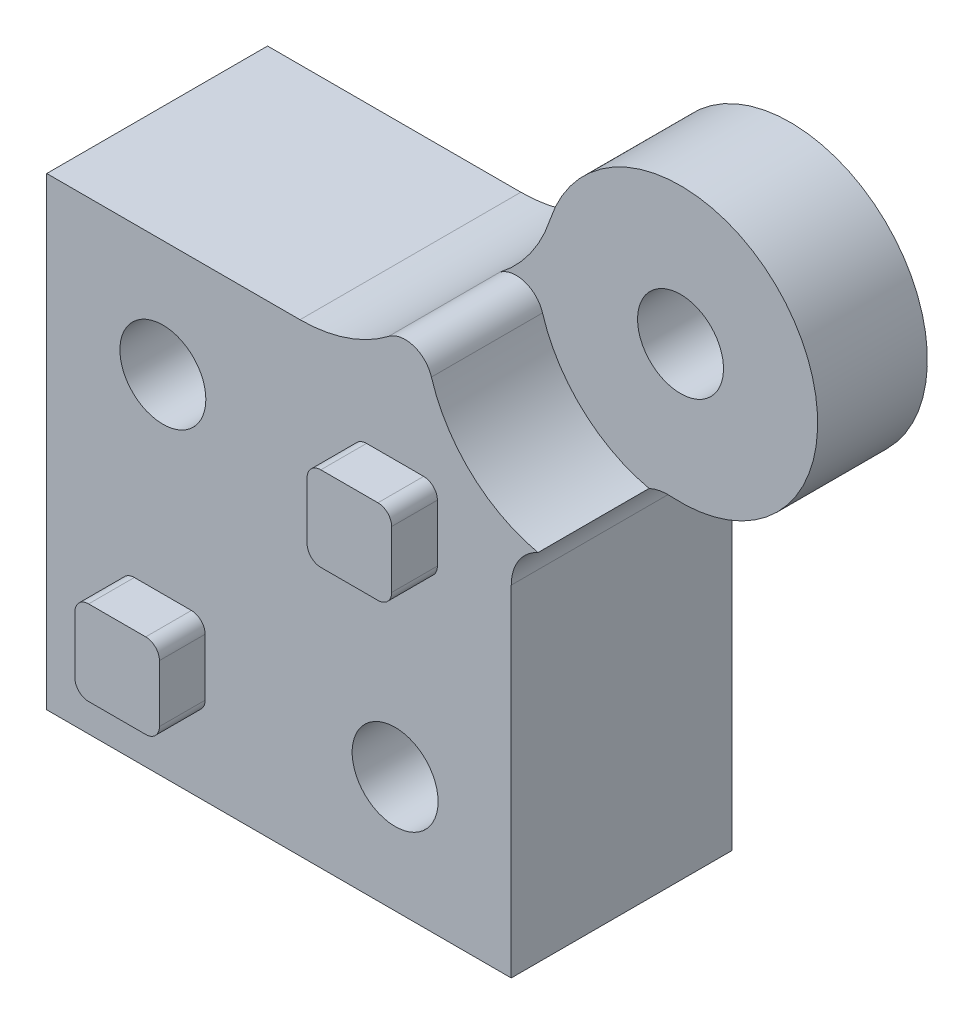
ISO-10303-21;
HEADER;
FILE_DESCRIPTION(('STEP AP214'),'2;1');
FILE_NAME('part.step','',(''),(''),'','','');
FILE_SCHEMA(('AUTOMOTIVE_DESIGN { 1 0 10303 214 1 1 1 1 }'));
ENDSEC;
DATA;
#1=APPLICATION_CONTEXT('core data for automotive mechanical design processes');
#2=APPLICATION_PROTOCOL_DEFINITION('international standard','automotive_design',2000,#1);
#3=PRODUCT_CONTEXT('',#1,'mechanical');
#4=PRODUCT('Part','Part','',(#3));
#5=PRODUCT_RELATED_PRODUCT_CATEGORY('part','',(#4));
#6=PRODUCT_DEFINITION_FORMATION('','',#4);
#7=PRODUCT_DEFINITION_CONTEXT('part definition',#1,'design');
#8=PRODUCT_DEFINITION('design','',#6,#7);
#9=PRODUCT_DEFINITION_SHAPE('','',#8);
#10=(LENGTH_UNIT() NAMED_UNIT(*) SI_UNIT(.MILLI.,.METRE.));
#11=(NAMED_UNIT(*) PLANE_ANGLE_UNIT() SI_UNIT($,.RADIAN.));
#12=(NAMED_UNIT(*) SI_UNIT($,.STERADIAN.) SOLID_ANGLE_UNIT());
#13=UNCERTAINTY_MEASURE_WITH_UNIT(LENGTH_MEASURE(1.E-05),#10,'distance_accuracy_value','');
#14=(GEOMETRIC_REPRESENTATION_CONTEXT(3) GLOBAL_UNCERTAINTY_ASSIGNED_CONTEXT((#13)) GLOBAL_UNIT_ASSIGNED_CONTEXT((#10,
#11,#12)) REPRESENTATION_CONTEXT('',''));
#15=CARTESIAN_POINT('',(0.,0.,0.));
#16=DIRECTION('',(0.,0.,1.));
#17=DIRECTION('',(1.,0.,0.));
#18=AXIS2_PLACEMENT_3D('',#15,#16,#17);
#19=CARTESIAN_POINT('',(66.6819805153394,193.68198051534,0.));
#20=DIRECTION('',(0.,0.,1.));
#21=DIRECTION('',(1.,0.,0.));
#22=AXIS2_PLACEMENT_3D('',#19,#20,#21);
#23=PLANE('',#22);
#24=CARTESIAN_POINT('',(44.45,184.15,0.));
#25=DIRECTION('',(0.,0.,1.));
#26=DIRECTION('',(1.,0.,0.));
#27=AXIS2_PLACEMENT_3D('',#24,#25,#26);
#28=CIRCLE('',#27,2.34999999999999);
#29=CARTESIAN_POINT('',(46.8,184.15,0.));
#30=VERTEX_POINT('',#29);
#31=EDGE_CURVE('E252',#30,#30,#28,.T.);
#32=ORIENTED_EDGE('',*,*,#31,.F.);
#33=EDGE_LOOP('',(#32));
#34=FACE_BOUND('',#33,.T.);
#35=CARTESIAN_POINT('',(57.15,171.45,0.));
#36=DIRECTION('',(0.,0.,1.));
#37=DIRECTION('',(1.,0.,0.));
#38=AXIS2_PLACEMENT_3D('',#35,#36,#37);
#39=CIRCLE('',#38,2.34999999999997);
#40=CARTESIAN_POINT('',(59.5,171.45,0.));
#41=VERTEX_POINT('',#40);
#42=EDGE_CURVE('E243',#41,#41,#39,.T.);
#43=ORIENTED_EDGE('',*,*,#42,.F.);
#44=EDGE_LOOP('',(#43));
#45=FACE_BOUND('',#44,.T.);
#46=CARTESIAN_POINT('',(66.6819805153394,193.68198051534,0.));
#47=DIRECTION('',(0.,0.,-1.));
#48=DIRECTION('',(1.,0.,0.));
#49=AXIS2_PLACEMENT_3D('',#46,#47,#48);
#50=CIRCLE('',#49,7.89061359961946);
#51=CARTESIAN_POINT('',(64.9642375577398,185.980607773411,0.));
#52=VERTEX_POINT('',#51);
#53=CARTESIAN_POINT('',(59.1355752557885,191.376866497092,0.));
#54=VERTEX_POINT('',#53);
#55=EDGE_CURVE('E269',#52,#54,#50,.T.);
#56=ORIENTED_EDGE('',*,*,#55,.T.);
#57=CARTESIAN_POINT('',(57.701009014974,190.938665971402,0.));
#58=DIRECTION('',(0.,0.,1.));
#59=DIRECTION('',(1.,0.,0.));
#60=AXIS2_PLACEMENT_3D('',#57,#58,#59);
#61=CIRCLE('',#60,1.5);
#62=CARTESIAN_POINT('',(56.7929258165762,192.132560818022,0.));
#63=VERTEX_POINT('',#62);
#64=EDGE_CURVE('E348',#54,#63,#61,.T.);
#65=ORIENTED_EDGE('',*,*,#64,.T.);
#66=CARTESIAN_POINT('',(51.9498154251216,198.5,0.));
#67=DIRECTION('',(0.,0.,1.));
#68=DIRECTION('',(1.,0.,0.));
#69=AXIS2_PLACEMENT_3D('',#66,#67,#68);
#70=CIRCLE('',#69,8.);
#71=CARTESIAN_POINT('',(51.9498154251216,190.5,0.));
#72=VERTEX_POINT('',#71);
#73=EDGE_CURVE('E341',#63,#72,#70,.F.);
#74=ORIENTED_EDGE('',*,*,#73,.T.);
#75=DIRECTION('',(-1.,0.,0.));
#76=VECTOR('',#75,1.);
#77=CARTESIAN_POINT('',(38.1,190.5,0.));
#78=LINE('',#77,#76);
#79=CARTESIAN_POINT('',(38.1,190.5,0.));
#80=VERTEX_POINT('',#79);
#81=EDGE_CURVE('E285',#72,#80,#78,.T.);
#82=ORIENTED_EDGE('',*,*,#81,.T.);
#83=DIRECTION('',(0.,-1.,0.));
#84=VECTOR('',#83,1.);
#85=CARTESIAN_POINT('',(38.1,165.1,0.));
#86=LINE('',#85,#84);
#87=CARTESIAN_POINT('',(38.1,165.1,0.));
#88=VERTEX_POINT('',#87);
#89=EDGE_CURVE('E287',#80,#88,#86,.T.);
#90=ORIENTED_EDGE('',*,*,#89,.T.);
#91=DIRECTION('',(1.,0.,0.));
#92=VECTOR('',#91,1.);
#93=CARTESIAN_POINT('',(63.5,165.1,0.));
#94=LINE('',#93,#92);
#95=CARTESIAN_POINT('',(63.5,165.1,0.));
#96=VERTEX_POINT('',#95);
#97=EDGE_CURVE('E290',#88,#96,#94,.T.);
#98=ORIENTED_EDGE('',*,*,#97,.T.);
#99=DIRECTION('',(0.,1.,0.));
#100=VECTOR('',#99,1.);
#101=CARTESIAN_POINT('',(63.5,186.4614,0.));
#102=LINE('',#101,#100);
#103=CARTESIAN_POINT('',(63.5,183.70526248902,0.));
#104=VERTEX_POINT('',#103);
#105=EDGE_CURVE('E215',#96,#104,#102,.T.);
#106=ORIENTED_EDGE('',*,*,#105,.T.);
#107=CARTESIAN_POINT('',(66.,183.70526248902,0.));
#108=DIRECTION('',(0.,0.,1.));
#109=DIRECTION('',(1.,0.,0.));
#110=AXIS2_PLACEMENT_3D('',#107,#108,#109);
#111=CIRCLE('',#110,2.5);
#112=EDGE_CURVE('E324',#104,#52,#111,.F.);
#113=ORIENTED_EDGE('',*,*,#112,.T.);
#114=EDGE_LOOP('',(#56,#65,#74,#82,#90,#98,#106,#113));
#115=FACE_BOUND('',#114,.T.);
#116=DIRECTION('',(0.,1.,0.));
#117=VECTOR('',#116,1.);
#118=CARTESIAN_POINT('',(59.4614,181.8386,0.));
#119=LINE('',#118,#117);
#120=CARTESIAN_POINT('',(59.4614,182.5886,0.));
#121=VERTEX_POINT('',#120);
#122=CARTESIAN_POINT('',(59.4614,185.7114,0.));
#123=VERTEX_POINT('',#122);
#124=EDGE_CURVE('E219',#121,#123,#119,.T.);
#125=ORIENTED_EDGE('',*,*,#124,.F.);
#126=CARTESIAN_POINT('',(58.7114,182.5886,0.));
#127=DIRECTION('',(0.,0.,1.));
#128=DIRECTION('',(1.,0.,0.));
#129=AXIS2_PLACEMENT_3D('',#126,#127,#128);
#130=CIRCLE('',#129,0.75);
#131=CARTESIAN_POINT('',(58.7114,181.8386,0.));
#132=VERTEX_POINT('',#131);
#133=EDGE_CURVE('E412',#121,#132,#130,.F.);
#134=ORIENTED_EDGE('',*,*,#133,.T.);
#135=DIRECTION('',(1.,0.,0.));
#136=VECTOR('',#135,1.);
#137=CARTESIAN_POINT('',(54.8386,181.8386,0.));
#138=LINE('',#137,#136);
#139=CARTESIAN_POINT('',(55.5886,181.8386,0.));
#140=VERTEX_POINT('',#139);
#141=EDGE_CURVE('E300',#140,#132,#138,.T.);
#142=ORIENTED_EDGE('',*,*,#141,.F.);
#143=CARTESIAN_POINT('',(55.5886,182.5886,0.));
#144=DIRECTION('',(0.,0.,1.));
#145=DIRECTION('',(1.,0.,0.));
#146=AXIS2_PLACEMENT_3D('',#143,#144,#145);
#147=CIRCLE('',#146,0.75);
#148=CARTESIAN_POINT('',(54.8386,182.5886,0.));
#149=VERTEX_POINT('',#148);
#150=EDGE_CURVE('E416',#140,#149,#147,.F.);
#151=ORIENTED_EDGE('',*,*,#150,.T.);
#152=DIRECTION('',(0.,-1.,0.));
#153=VECTOR('',#152,1.);
#154=CARTESIAN_POINT('',(54.8386,186.4614,0.));
#155=LINE('',#154,#153);
#156=CARTESIAN_POINT('',(54.8386,185.7114,0.));
#157=VERTEX_POINT('',#156);
#158=EDGE_CURVE('E315',#157,#149,#155,.T.);
#159=ORIENTED_EDGE('',*,*,#158,.F.);
#160=CARTESIAN_POINT('',(55.5886,185.7114,0.));
#161=DIRECTION('',(0.,0.,1.));
#162=DIRECTION('',(1.,0.,0.));
#163=AXIS2_PLACEMENT_3D('',#160,#161,#162);
#164=CIRCLE('',#163,0.75);
#165=CARTESIAN_POINT('',(55.5886,186.4614,0.));
#166=VERTEX_POINT('',#165);
#167=EDGE_CURVE('E414',#157,#166,#164,.F.);
#168=ORIENTED_EDGE('',*,*,#167,.T.);
#169=DIRECTION('',(-1.,0.,0.));
#170=VECTOR('',#169,1.);
#171=CARTESIAN_POINT('',(59.4614,186.4614,0.));
#172=LINE('',#171,#170);
#173=CARTESIAN_POINT('',(58.7114,186.4614,0.));
#174=VERTEX_POINT('',#173);
#175=EDGE_CURVE('E312',#174,#166,#172,.T.);
#176=ORIENTED_EDGE('',*,*,#175,.F.);
#177=CARTESIAN_POINT('',(58.7114,185.7114,0.));
#178=DIRECTION('',(0.,0.,1.));
#179=DIRECTION('',(1.,0.,0.));
#180=AXIS2_PLACEMENT_3D('',#177,#178,#179);
#181=CIRCLE('',#180,0.75);
#182=EDGE_CURVE('E410',#174,#123,#181,.F.);
#183=ORIENTED_EDGE('',*,*,#182,.T.);
#184=EDGE_LOOP('',(#125,#134,#142,#151,#159,#168,#176,#183));
#185=FACE_BOUND('',#184,.T.);
#186=DIRECTION('',(0.,-1.,0.));
#187=VECTOR('',#186,1.);
#188=CARTESIAN_POINT('',(42.1386,173.7614,0.));
#189=LINE('',#188,#187);
#190=CARTESIAN_POINT('',(42.1386,173.0114,0.));
#191=VERTEX_POINT('',#190);
#192=CARTESIAN_POINT('',(42.1386,169.8886,0.));
#193=VERTEX_POINT('',#192);
#194=EDGE_CURVE('E272',#191,#193,#189,.T.);
#195=ORIENTED_EDGE('',*,*,#194,.F.);
#196=CARTESIAN_POINT('',(42.8886,173.0114,0.));
#197=DIRECTION('',(0.,0.,1.));
#198=DIRECTION('',(1.,0.,0.));
#199=AXIS2_PLACEMENT_3D('',#196,#197,#198);
#200=CIRCLE('',#199,0.75);
#201=CARTESIAN_POINT('',(42.8886,173.7614,0.));
#202=VERTEX_POINT('',#201);
#203=EDGE_CURVE('E11',#191,#202,#200,.F.);
#204=ORIENTED_EDGE('',*,*,#203,.T.);
#205=DIRECTION('',(-1.,0.,0.));
#206=VECTOR('',#205,1.);
#207=CARTESIAN_POINT('',(46.7614,173.7614,0.));
#208=LINE('',#207,#206);
#209=CARTESIAN_POINT('',(46.0114,173.7614,0.));
#210=VERTEX_POINT('',#209);
#211=EDGE_CURVE('E255',#210,#202,#208,.T.);
#212=ORIENTED_EDGE('',*,*,#211,.F.);
#213=CARTESIAN_POINT('',(46.0114,173.0114,0.));
#214=DIRECTION('',(0.,0.,1.));
#215=DIRECTION('',(1.,0.,0.));
#216=AXIS2_PLACEMENT_3D('',#213,#214,#215);
#217=CIRCLE('',#216,0.75);
#218=CARTESIAN_POINT('',(46.7614,173.0114,0.));
#219=VERTEX_POINT('',#218);
#220=EDGE_CURVE('E418',#210,#219,#217,.F.);
#221=ORIENTED_EDGE('',*,*,#220,.T.);
#222=DIRECTION('',(0.,1.,0.));
#223=VECTOR('',#222,1.);
#224=CARTESIAN_POINT('',(46.7614,169.1386,0.));
#225=LINE('',#224,#223);
#226=CARTESIAN_POINT('',(46.7614,169.8886,0.));
#227=VERTEX_POINT('',#226);
#228=EDGE_CURVE('E260',#227,#219,#225,.T.);
#229=ORIENTED_EDGE('',*,*,#228,.F.);
#230=CARTESIAN_POINT('',(46.0114,169.8886,0.));
#231=DIRECTION('',(0.,0.,1.));
#232=DIRECTION('',(1.,0.,0.));
#233=AXIS2_PLACEMENT_3D('',#230,#231,#232);
#234=CIRCLE('',#233,0.75);
#235=CARTESIAN_POINT('',(46.0114,169.1386,0.));
#236=VERTEX_POINT('',#235);
#237=EDGE_CURVE('E420',#227,#236,#234,.F.);
#238=ORIENTED_EDGE('',*,*,#237,.T.);
#239=DIRECTION('',(1.,0.,0.));
#240=VECTOR('',#239,1.);
#241=CARTESIAN_POINT('',(42.1386,169.1386,0.));
#242=LINE('',#241,#240);
#243=CARTESIAN_POINT('',(42.8886,169.1386,0.));
#244=VERTEX_POINT('',#243);
#245=EDGE_CURVE('E274',#244,#236,#242,.T.);
#246=ORIENTED_EDGE('',*,*,#245,.F.);
#247=CARTESIAN_POINT('',(42.8886,169.8886,0.));
#248=DIRECTION('',(0.,0.,1.));
#249=DIRECTION('',(1.,0.,0.));
#250=AXIS2_PLACEMENT_3D('',#247,#248,#249);
#251=CIRCLE('',#250,0.75);
#252=EDGE_CURVE('E43',#244,#193,#251,.F.);
#253=ORIENTED_EDGE('',*,*,#252,.T.);
#254=EDGE_LOOP('',(#195,#204,#212,#221,#229,#238,#246,#253));
#255=FACE_BOUND('',#254,.T.);
#256=ADVANCED_FACE('F35',(#34,#45,#115,#185,#255),#23,.T.);
#257=CARTESIAN_POINT('',(59.4614,181.8386,2.5));
#258=DIRECTION('',(-1.,0.,0.));
#259=DIRECTION('',(0.,0.,1.));
#260=AXIS2_PLACEMENT_3D('',#257,#258,#259);
#261=PLANE('',#260);
#262=ORIENTED_EDGE('',*,*,#124,.T.);
#263=DIRECTION('',(0.,0.,-1.));
#264=VECTOR('',#263,1.);
#265=CARTESIAN_POINT('',(59.4614,185.7114,2.5));
#266=LINE('',#265,#264);
#267=CARTESIAN_POINT('',(59.4614,185.7114,2.5));
#268=VERTEX_POINT('',#267);
#269=EDGE_CURVE('E363',#123,#268,#266,.F.);
#270=ORIENTED_EDGE('',*,*,#269,.T.);
#271=DIRECTION('',(0.,1.,0.));
#272=VECTOR('',#271,1.);
#273=CARTESIAN_POINT('',(59.4614,181.8386,2.5));
#274=LINE('',#273,#272);
#275=CARTESIAN_POINT('',(59.4614,182.5886,2.5));
#276=VERTEX_POINT('',#275);
#277=EDGE_CURVE('E296',#276,#268,#274,.T.);
#278=ORIENTED_EDGE('',*,*,#277,.F.);
#279=DIRECTION('',(0.,0.,-1.));
#280=VECTOR('',#279,1.);
#281=CARTESIAN_POINT('',(59.4614,182.5886,2.5));
#282=LINE('',#281,#280);
#283=EDGE_CURVE('E360',#276,#121,#282,.T.);
#284=ORIENTED_EDGE('',*,*,#283,.T.);
#285=EDGE_LOOP('',(#262,#270,#278,#284));
#286=FACE_BOUND('',#285,.T.);
#287=ADVANCED_FACE('F460',(#286),#261,.F.);
#288=CARTESIAN_POINT('',(59.4614,186.4614,2.5));
#289=DIRECTION('',(0.,-1.,0.));
#290=DIRECTION('',(0.,0.,-1.));
#291=AXIS2_PLACEMENT_3D('',#288,#289,#290);
#292=PLANE('',#291);
#293=DIRECTION('',(-1.,0.,0.));
#294=VECTOR('',#293,1.);
#295=CARTESIAN_POINT('',(59.4614,186.4614,2.5));
#296=LINE('',#295,#294);
#297=CARTESIAN_POINT('',(58.7114,186.4614,2.5));
#298=VERTEX_POINT('',#297);
#299=CARTESIAN_POINT('',(55.5886,186.4614,2.5));
#300=VERTEX_POINT('',#299);
#301=EDGE_CURVE('E299',#298,#300,#296,.T.);
#302=ORIENTED_EDGE('',*,*,#301,.F.);
#303=DIRECTION('',(0.,0.,-1.));
#304=VECTOR('',#303,1.);
#305=CARTESIAN_POINT('',(58.7114,186.4614,2.5));
#306=LINE('',#305,#304);
#307=EDGE_CURVE('E357',#298,#174,#306,.T.);
#308=ORIENTED_EDGE('',*,*,#307,.T.);
#309=ORIENTED_EDGE('',*,*,#175,.T.);
#310=DIRECTION('',(0.,0.,-1.));
#311=VECTOR('',#310,1.);
#312=CARTESIAN_POINT('',(55.5886,186.4614,2.5));
#313=LINE('',#312,#311);
#314=EDGE_CURVE('E355',#166,#300,#313,.F.);
#315=ORIENTED_EDGE('',*,*,#314,.T.);
#316=EDGE_LOOP('',(#302,#308,#309,#315));
#317=FACE_BOUND('',#316,.T.);
#318=ADVANCED_FACE('F467',(#317),#292,.F.);
#319=CARTESIAN_POINT('',(54.8386,186.4614,2.5));
#320=DIRECTION('',(1.,0.,0.));
#321=DIRECTION('',(0.,0.,-1.));
#322=AXIS2_PLACEMENT_3D('',#319,#320,#321);
#323=PLANE('',#322);
#324=DIRECTION('',(0.,-1.,0.));
#325=VECTOR('',#324,1.);
#326=CARTESIAN_POINT('',(54.8386,186.4614,2.5));
#327=LINE('',#326,#325);
#328=CARTESIAN_POINT('',(54.8386,185.7114,2.5));
#329=VERTEX_POINT('',#328);
#330=CARTESIAN_POINT('',(54.8386,182.5886,2.5));
#331=VERTEX_POINT('',#330);
#332=EDGE_CURVE('E303',#329,#331,#327,.T.);
#333=ORIENTED_EDGE('',*,*,#332,.F.);
#334=DIRECTION('',(0.,0.,-1.));
#335=VECTOR('',#334,1.);
#336=CARTESIAN_POINT('',(54.8386,185.7114,2.5));
#337=LINE('',#336,#335);
#338=EDGE_CURVE('E380',#329,#157,#337,.T.);
#339=ORIENTED_EDGE('',*,*,#338,.T.);
#340=ORIENTED_EDGE('',*,*,#158,.T.);
#341=DIRECTION('',(0.,0.,-1.));
#342=VECTOR('',#341,1.);
#343=CARTESIAN_POINT('',(54.8386,182.5886,2.5));
#344=LINE('',#343,#342);
#345=EDGE_CURVE('E378',#149,#331,#344,.F.);
#346=ORIENTED_EDGE('',*,*,#345,.T.);
#347=EDGE_LOOP('',(#333,#339,#340,#346));
#348=FACE_BOUND('',#347,.T.);
#349=ADVANCED_FACE('F498',(#348),#323,.F.);
#350=CARTESIAN_POINT('',(54.8386,181.8386,2.5));
#351=DIRECTION('',(0.,1.,0.));
#352=DIRECTION('',(0.,0.,1.));
#353=AXIS2_PLACEMENT_3D('',#350,#351,#352);
#354=PLANE('',#353);
#355=ORIENTED_EDGE('',*,*,#141,.T.);
#356=DIRECTION('',(0.,0.,-1.));
#357=VECTOR('',#356,1.);
#358=CARTESIAN_POINT('',(58.7114,181.8386,2.5));
#359=LINE('',#358,#357);
#360=CARTESIAN_POINT('',(58.7114,181.8386,2.5));
#361=VERTEX_POINT('',#360);
#362=EDGE_CURVE('E376',#132,#361,#359,.F.);
#363=ORIENTED_EDGE('',*,*,#362,.T.);
#364=DIRECTION('',(1.,0.,0.));
#365=VECTOR('',#364,1.);
#366=CARTESIAN_POINT('',(54.8386,181.8386,2.5));
#367=LINE('',#366,#365);
#368=CARTESIAN_POINT('',(55.5886,181.8386,2.5));
#369=VERTEX_POINT('',#368);
#370=EDGE_CURVE('E306',#369,#361,#367,.T.);
#371=ORIENTED_EDGE('',*,*,#370,.F.);
#372=DIRECTION('',(0.,0.,-1.));
#373=VECTOR('',#372,1.);
#374=CARTESIAN_POINT('',(55.5886,181.8386,2.5));
#375=LINE('',#374,#373);
#376=EDGE_CURVE('E373',#369,#140,#375,.T.);
#377=ORIENTED_EDGE('',*,*,#376,.T.);
#378=EDGE_LOOP('',(#355,#363,#371,#377));
#379=FACE_BOUND('',#378,.T.);
#380=ADVANCED_FACE('F494',(#379),#354,.F.);
#381=CARTESIAN_POINT('',(0.,0.,2.5));
#382=DIRECTION('',(0.,0.,1.));
#383=DIRECTION('',(1.,0.,0.));
#384=AXIS2_PLACEMENT_3D('',#381,#382,#383);
#385=PLANE('',#384);
#386=ORIENTED_EDGE('',*,*,#277,.T.);
#387=CARTESIAN_POINT('',(58.7114,185.7114,2.5));
#388=DIRECTION('',(0.,0.,1.));
#389=DIRECTION('',(1.,0.,0.));
#390=AXIS2_PLACEMENT_3D('',#387,#388,#389);
#391=CIRCLE('',#390,0.75);
#392=EDGE_CURVE('E371',#268,#298,#391,.T.);
#393=ORIENTED_EDGE('',*,*,#392,.T.);
#394=ORIENTED_EDGE('',*,*,#301,.T.);
#395=CARTESIAN_POINT('',(55.5886,185.7114,2.5));
#396=DIRECTION('',(0.,0.,1.));
#397=DIRECTION('',(1.,0.,0.));
#398=AXIS2_PLACEMENT_3D('',#395,#396,#397);
#399=CIRCLE('',#398,0.75);
#400=EDGE_CURVE('E367',#300,#329,#399,.T.);
#401=ORIENTED_EDGE('',*,*,#400,.T.);
#402=ORIENTED_EDGE('',*,*,#332,.T.);
#403=CARTESIAN_POINT('',(55.5886,182.5886,2.5));
#404=DIRECTION('',(0.,0.,1.));
#405=DIRECTION('',(1.,0.,0.));
#406=AXIS2_PLACEMENT_3D('',#403,#404,#405);
#407=CIRCLE('',#406,0.75);
#408=EDGE_CURVE('E365',#331,#369,#407,.T.);
#409=ORIENTED_EDGE('',*,*,#408,.T.);
#410=ORIENTED_EDGE('',*,*,#370,.T.);
#411=CARTESIAN_POINT('',(58.7114,182.5886,2.5));
#412=DIRECTION('',(0.,0.,1.));
#413=DIRECTION('',(1.,0.,0.));
#414=AXIS2_PLACEMENT_3D('',#411,#412,#413);
#415=CIRCLE('',#414,0.75);
#416=EDGE_CURVE('E369',#361,#276,#415,.T.);
#417=ORIENTED_EDGE('',*,*,#416,.T.);
#418=EDGE_LOOP('',(#386,#393,#394,#401,#402,#409,#410,#417));
#419=FACE_BOUND('',#418,.T.);
#420=ADVANCED_FACE('F490',(#419),#385,.T.);
#421=CARTESIAN_POINT('',(66.6819805153394,193.68198051534,-6.075));
#422=DIRECTION('',(0.,0.,1.));
#423=DIRECTION('',(1.,0.,0.));
#424=AXIS2_PLACEMENT_3D('',#421,#422,#423);
#425=CYLINDRICAL_SURFACE('',#424,7.89061359961946);
#426=CARTESIAN_POINT('',(66.6819805153394,193.68198051534,-6.075));
#427=DIRECTION('',(0.,0.,-1.));
#428=DIRECTION('',(1.,0.,0.));
#429=AXIS2_PLACEMENT_3D('',#426,#427,#428);
#430=CIRCLE('',#429,7.89061359961946);
#431=CARTESIAN_POINT('',(64.9642375577398,185.980607773411,-6.075));
#432=VERTEX_POINT('',#431);
#433=CARTESIAN_POINT('',(59.1355752557885,191.376866497092,-6.075));
#434=VERTEX_POINT('',#433);
#435=EDGE_CURVE('E279',#432,#434,#430,.T.);
#436=ORIENTED_EDGE('',*,*,#435,.T.);
#437=DIRECTION('',(0.,0.,1.));
#438=VECTOR('',#437,1.);
#439=CARTESIAN_POINT('',(59.1355752557885,191.376866497092,-6.075));
#440=LINE('',#439,#438);
#441=EDGE_CURVE('E345',#434,#54,#440,.T.);
#442=ORIENTED_EDGE('',*,*,#441,.T.);
#443=ORIENTED_EDGE('',*,*,#55,.F.);
#444=DIRECTION('',(0.,0.,1.));
#445=VECTOR('',#444,1.);
#446=CARTESIAN_POINT('',(64.9642375577398,185.980607773411,0.));
#447=LINE('',#446,#445);
#448=EDGE_CURVE('E327',#52,#432,#447,.F.);
#449=ORIENTED_EDGE('',*,*,#448,.T.);
#450=EDGE_LOOP('',(#436,#442,#443,#449));
#451=FACE_BOUND('',#450,.T.);
#452=ADVANCED_FACE('F477',(#451),#425,.F.);
#453=CARTESIAN_POINT('',(63.5,186.4614,-6.075));
#454=DIRECTION('',(1.,0.,0.));
#455=DIRECTION('',(0.,0.,-1.));
#456=AXIS2_PLACEMENT_3D('',#453,#454,#455);
#457=PLANE('',#456);
#458=DIRECTION('',(0.,1.,0.));
#459=VECTOR('',#458,1.);
#460=CARTESIAN_POINT('',(63.5,0.,-12.075));
#461=LINE('',#460,#459);
#462=CARTESIAN_POINT('',(63.5,165.1,-12.075));
#463=VERTEX_POINT('',#462);
#464=CARTESIAN_POINT('',(63.5,183.70526248902,-12.075));
#465=VERTEX_POINT('',#464);
#466=EDGE_CURVE('E212',#463,#465,#461,.T.);
#467=ORIENTED_EDGE('',*,*,#466,.T.);
#468=DIRECTION('',(0.,0.,1.));
#469=VECTOR('',#468,1.);
#470=CARTESIAN_POINT('',(63.5,183.70526248902,-6.075));
#471=LINE('',#470,#469);
#472=EDGE_CURVE('E309',#465,#104,#471,.T.);
#473=ORIENTED_EDGE('',*,*,#472,.T.);
#474=ORIENTED_EDGE('',*,*,#105,.F.);
#475=DIRECTION('',(0.,0.,1.));
#476=VECTOR('',#475,1.);
#477=CARTESIAN_POINT('',(63.5,165.1,-6.075));
#478=LINE('',#477,#476);
#479=EDGE_CURVE('E207',#463,#96,#478,.T.);
#480=ORIENTED_EDGE('',*,*,#479,.F.);
#481=EDGE_LOOP('',(#467,#473,#474,#480));
#482=FACE_BOUND('',#481,.T.);
#483=ADVANCED_FACE('F209',(#482),#457,.T.);
#484=CARTESIAN_POINT('',(63.5,165.1,-6.075));
#485=DIRECTION('',(0.,-1.,0.));
#486=DIRECTION('',(0.,0.,-1.));
#487=AXIS2_PLACEMENT_3D('',#484,#485,#486);
#488=PLANE('',#487);
#489=ORIENTED_EDGE('',*,*,#97,.F.);
#490=DIRECTION('',(0.,0.,1.));
#491=VECTOR('',#490,1.);
#492=CARTESIAN_POINT('',(38.1,165.1,-6.075));
#493=LINE('',#492,#491);
#494=CARTESIAN_POINT('',(38.1,165.1,-12.075));
#495=VERTEX_POINT('',#494);
#496=EDGE_CURVE('E220',#495,#88,#493,.T.);
#497=ORIENTED_EDGE('',*,*,#496,.F.);
#498=DIRECTION('',(-1.,0.,0.));
#499=VECTOR('',#498,1.);
#500=CARTESIAN_POINT('',(0.,165.1,-12.075));
#501=LINE('',#500,#499);
#502=EDGE_CURVE('E223',#463,#495,#501,.T.);
#503=ORIENTED_EDGE('',*,*,#502,.F.);
#504=ORIENTED_EDGE('',*,*,#479,.T.);
#505=EDGE_LOOP('',(#489,#497,#503,#504));
#506=FACE_BOUND('',#505,.T.);
#507=ADVANCED_FACE('F224',(#506),#488,.T.);
#508=CARTESIAN_POINT('',(38.1,165.1,-6.075));
#509=DIRECTION('',(-1.,0.,0.));
#510=DIRECTION('',(0.,0.,1.));
#511=AXIS2_PLACEMENT_3D('',#508,#509,#510);
#512=PLANE('',#511);
#513=ORIENTED_EDGE('',*,*,#89,.F.);
#514=DIRECTION('',(0.,0.,1.));
#515=VECTOR('',#514,1.);
#516=CARTESIAN_POINT('',(38.1,190.5,-6.075));
#517=LINE('',#516,#515);
#518=CARTESIAN_POINT('',(38.1,190.5,-12.075));
#519=VERTEX_POINT('',#518);
#520=EDGE_CURVE('E282',#519,#80,#517,.T.);
#521=ORIENTED_EDGE('',*,*,#520,.F.);
#522=DIRECTION('',(0.,1.,0.));
#523=VECTOR('',#522,1.);
#524=CARTESIAN_POINT('',(38.1,0.,-12.075));
#525=LINE('',#524,#523);
#526=EDGE_CURVE('E228',#495,#519,#525,.T.);
#527=ORIENTED_EDGE('',*,*,#526,.F.);
#528=ORIENTED_EDGE('',*,*,#496,.T.);
#529=EDGE_LOOP('',(#513,#521,#527,#528));
#530=FACE_BOUND('',#529,.T.);
#531=ADVANCED_FACE('F480',(#530),#512,.T.);
#532=CARTESIAN_POINT('',(38.1,190.5,-6.075));
#533=DIRECTION('',(0.,1.,0.));
#534=DIRECTION('',(0.,0.,1.));
#535=AXIS2_PLACEMENT_3D('',#532,#533,#534);
#536=PLANE('',#535);
#537=ORIENTED_EDGE('',*,*,#81,.F.);
#538=DIRECTION('',(0.,0.,1.));
#539=VECTOR('',#538,1.);
#540=CARTESIAN_POINT('',(51.9498154251216,190.5,-6.075));
#541=LINE('',#540,#539);
#542=CARTESIAN_POINT('',(51.9498154251216,190.5,-12.075));
#543=VERTEX_POINT('',#542);
#544=EDGE_CURVE('E337',#72,#543,#541,.F.);
#545=ORIENTED_EDGE('',*,*,#544,.T.);
#546=DIRECTION('',(1.,0.,0.));
#547=VECTOR('',#546,1.);
#548=CARTESIAN_POINT('',(0.,190.5,-12.075));
#549=LINE('',#548,#547);
#550=EDGE_CURVE('E241',#519,#543,#549,.T.);
#551=ORIENTED_EDGE('',*,*,#550,.F.);
#552=ORIENTED_EDGE('',*,*,#520,.T.);
#553=EDGE_LOOP('',(#537,#545,#551,#552));
#554=FACE_BOUND('',#553,.T.);
#555=ADVANCED_FACE('F483',(#554),#536,.T.);
#556=CARTESIAN_POINT('',(46.7614,173.7614,2.5));
#557=DIRECTION('',(0.,-1.,0.));
#558=DIRECTION('',(0.,0.,-1.));
#559=AXIS2_PLACEMENT_3D('',#556,#557,#558);
#560=PLANE('',#559);
#561=DIRECTION('',(-1.,0.,0.));
#562=VECTOR('',#561,1.);
#563=CARTESIAN_POINT('',(46.7614,173.7614,2.5));
#564=LINE('',#563,#562);
#565=CARTESIAN_POINT('',(46.0114,173.7614,2.5));
#566=VERTEX_POINT('',#565);
#567=CARTESIAN_POINT('',(42.8886,173.7614,2.5));
#568=VERTEX_POINT('',#567);
#569=EDGE_CURVE('E256',#566,#568,#564,.T.);
#570=ORIENTED_EDGE('',*,*,#569,.F.);
#571=DIRECTION('',(0.,0.,-1.));
#572=VECTOR('',#571,1.);
#573=CARTESIAN_POINT('',(46.0114,173.7614,2.5));
#574=LINE('',#573,#572);
#575=EDGE_CURVE('E385',#566,#210,#574,.T.);
#576=ORIENTED_EDGE('',*,*,#575,.T.);
#577=ORIENTED_EDGE('',*,*,#211,.T.);
#578=DIRECTION('',(0.,0.,-1.));
#579=VECTOR('',#578,1.);
#580=CARTESIAN_POINT('',(42.8886,173.7614,2.5));
#581=LINE('',#580,#579);
#582=EDGE_CURVE('E383',#202,#568,#581,.F.);
#583=ORIENTED_EDGE('',*,*,#582,.T.);
#584=EDGE_LOOP('',(#570,#576,#577,#583));
#585=FACE_BOUND('',#584,.T.);
#586=ADVANCED_FACE('F444',(#585),#560,.F.);
#587=CARTESIAN_POINT('',(42.1386,173.7614,2.5));
#588=DIRECTION('',(1.,0.,0.));
#589=DIRECTION('',(0.,0.,-1.));
#590=AXIS2_PLACEMENT_3D('',#587,#588,#589);
#591=PLANE('',#590);
#592=ORIENTED_EDGE('',*,*,#194,.T.);
#593=DIRECTION('',(0.,0.,-1.));
#594=VECTOR('',#593,1.);
#595=CARTESIAN_POINT('',(42.1386,169.8886,2.5));
#596=LINE('',#595,#594);
#597=CARTESIAN_POINT('',(42.1386,169.8886,2.5));
#598=VERTEX_POINT('',#597);
#599=EDGE_CURVE('E408',#193,#598,#596,.F.);
#600=ORIENTED_EDGE('',*,*,#599,.T.);
#601=DIRECTION('',(0.,-1.,0.));
#602=VECTOR('',#601,1.);
#603=CARTESIAN_POINT('',(42.1386,173.7614,2.5));
#604=LINE('',#603,#602);
#605=CARTESIAN_POINT('',(42.1386,173.0114,2.5));
#606=VERTEX_POINT('',#605);
#607=EDGE_CURVE('E259',#606,#598,#604,.T.);
#608=ORIENTED_EDGE('',*,*,#607,.F.);
#609=DIRECTION('',(0.,0.,-1.));
#610=VECTOR('',#609,1.);
#611=CARTESIAN_POINT('',(42.1386,173.0114,2.5));
#612=LINE('',#611,#610);
#613=EDGE_CURVE('E406',#606,#191,#612,.T.);
#614=ORIENTED_EDGE('',*,*,#613,.T.);
#615=EDGE_LOOP('',(#592,#600,#608,#614));
#616=FACE_BOUND('',#615,.T.);
#617=ADVANCED_FACE('F449',(#616),#591,.F.);
#618=CARTESIAN_POINT('',(42.1386,169.1386,2.5));
#619=DIRECTION('',(0.,1.,0.));
#620=DIRECTION('',(0.,0.,1.));
#621=AXIS2_PLACEMENT_3D('',#618,#619,#620);
#622=PLANE('',#621);
#623=ORIENTED_EDGE('',*,*,#245,.T.);
#624=DIRECTION('',(0.,0.,-1.));
#625=VECTOR('',#624,1.);
#626=CARTESIAN_POINT('',(46.0114,169.1386,2.5));
#627=LINE('',#626,#625);
#628=CARTESIAN_POINT('',(46.0114,169.1386,2.5));
#629=VERTEX_POINT('',#628);
#630=EDGE_CURVE('E404',#236,#629,#627,.F.);
#631=ORIENTED_EDGE('',*,*,#630,.T.);
#632=DIRECTION('',(1.,0.,0.));
#633=VECTOR('',#632,1.);
#634=CARTESIAN_POINT('',(42.1386,169.1386,2.5));
#635=LINE('',#634,#633);
#636=CARTESIAN_POINT('',(42.8886,169.1386,2.5));
#637=VERTEX_POINT('',#636);
#638=EDGE_CURVE('E263',#637,#629,#635,.T.);
#639=ORIENTED_EDGE('',*,*,#638,.F.);
#640=DIRECTION('',(0.,0.,-1.));
#641=VECTOR('',#640,1.);
#642=CARTESIAN_POINT('',(42.8886,169.1386,2.5));
#643=LINE('',#642,#641);
#644=EDGE_CURVE('E401',#637,#244,#643,.T.);
#645=ORIENTED_EDGE('',*,*,#644,.T.);
#646=EDGE_LOOP('',(#623,#631,#639,#645));
#647=FACE_BOUND('',#646,.T.);
#648=ADVANCED_FACE('F426',(#647),#622,.F.);
#649=CARTESIAN_POINT('',(46.7614,169.1386,2.5));
#650=DIRECTION('',(-1.,0.,0.));
#651=DIRECTION('',(0.,0.,1.));
#652=AXIS2_PLACEMENT_3D('',#649,#650,#651);
#653=PLANE('',#652);
#654=ORIENTED_EDGE('',*,*,#228,.T.);
#655=DIRECTION('',(0.,0.,-1.));
#656=VECTOR('',#655,1.);
#657=CARTESIAN_POINT('',(46.7614,173.0114,2.5));
#658=LINE('',#657,#656);
#659=CARTESIAN_POINT('',(46.7614,173.0114,2.5));
#660=VERTEX_POINT('',#659);
#661=EDGE_CURVE('E391',#219,#660,#658,.F.);
#662=ORIENTED_EDGE('',*,*,#661,.T.);
#663=DIRECTION('',(0.,1.,0.));
#664=VECTOR('',#663,1.);
#665=CARTESIAN_POINT('',(46.7614,169.1386,2.5));
#666=LINE('',#665,#664);
#667=CARTESIAN_POINT('',(46.7614,169.8886,2.5));
#668=VERTEX_POINT('',#667);
#669=EDGE_CURVE('E266',#668,#660,#666,.T.);
#670=ORIENTED_EDGE('',*,*,#669,.F.);
#671=DIRECTION('',(0.,0.,-1.));
#672=VECTOR('',#671,1.);
#673=CARTESIAN_POINT('',(46.7614,169.8886,2.5));
#674=LINE('',#673,#672);
#675=EDGE_CURVE('E388',#668,#227,#674,.T.);
#676=ORIENTED_EDGE('',*,*,#675,.T.);
#677=EDGE_LOOP('',(#654,#662,#670,#676));
#678=FACE_BOUND('',#677,.T.);
#679=ADVANCED_FACE('F436',(#678),#653,.F.);
#680=CARTESIAN_POINT('',(0.,0.,2.5));
#681=DIRECTION('',(0.,0.,1.));
#682=DIRECTION('',(1.,0.,0.));
#683=AXIS2_PLACEMENT_3D('',#680,#681,#682);
#684=PLANE('',#683);
#685=ORIENTED_EDGE('',*,*,#669,.T.);
#686=CARTESIAN_POINT('',(46.0114,173.0114,2.5));
#687=DIRECTION('',(0.,0.,1.));
#688=DIRECTION('',(1.,0.,0.));
#689=AXIS2_PLACEMENT_3D('',#686,#687,#688);
#690=CIRCLE('',#689,0.75);
#691=EDGE_CURVE('E399',#660,#566,#690,.T.);
#692=ORIENTED_EDGE('',*,*,#691,.T.);
#693=ORIENTED_EDGE('',*,*,#569,.T.);
#694=CARTESIAN_POINT('',(42.8886,173.0114,2.5));
#695=DIRECTION('',(0.,0.,1.));
#696=DIRECTION('',(1.,0.,0.));
#697=AXIS2_PLACEMENT_3D('',#694,#695,#696);
#698=CIRCLE('',#697,0.75);
#699=EDGE_CURVE('E393',#568,#606,#698,.T.);
#700=ORIENTED_EDGE('',*,*,#699,.T.);
#701=ORIENTED_EDGE('',*,*,#607,.T.);
#702=CARTESIAN_POINT('',(42.8886,169.8886,2.5));
#703=DIRECTION('',(0.,0.,1.));
#704=DIRECTION('',(1.,0.,0.));
#705=AXIS2_PLACEMENT_3D('',#702,#703,#704);
#706=CIRCLE('',#705,0.75);
#707=EDGE_CURVE('E395',#598,#637,#706,.T.);
#708=ORIENTED_EDGE('',*,*,#707,.T.);
#709=ORIENTED_EDGE('',*,*,#638,.T.);
#710=CARTESIAN_POINT('',(46.0114,169.8886,2.5));
#711=DIRECTION('',(0.,0.,1.));
#712=DIRECTION('',(1.,0.,0.));
#713=AXIS2_PLACEMENT_3D('',#710,#711,#712);
#714=CIRCLE('',#713,0.75);
#715=EDGE_CURVE('E397',#629,#668,#714,.T.);
#716=ORIENTED_EDGE('',*,*,#715,.T.);
#717=EDGE_LOOP('',(#685,#692,#693,#700,#701,#708,#709,#716));
#718=FACE_BOUND('',#717,.T.);
#719=ADVANCED_FACE('F433',(#718),#684,.T.);
#720=CARTESIAN_POINT('',(57.15,171.45,-6.075));
#721=DIRECTION('',(0.,0.,1.));
#722=DIRECTION('',(1.,0.,0.));
#723=AXIS2_PLACEMENT_3D('',#720,#721,#722);
#724=CYLINDRICAL_SURFACE('',#723,2.34999999999997);
#725=ORIENTED_EDGE('',*,*,#42,.T.);
#726=EDGE_LOOP('',(#725));
#727=FACE_BOUND('',#726,.T.);
#728=CARTESIAN_POINT('',(57.15,171.45,-12.075));
#729=DIRECTION('',(0.,0.,1.));
#730=DIRECTION('',(1.,0.,0.));
#731=AXIS2_PLACEMENT_3D('',#728,#729,#730);
#732=CIRCLE('',#731,2.34999999999998);
#733=CARTESIAN_POINT('',(59.5,171.45,-12.075));
#734=VERTEX_POINT('',#733);
#735=EDGE_CURVE('E802',#734,#734,#732,.T.);
#736=ORIENTED_EDGE('',*,*,#735,.F.);
#737=EDGE_LOOP('',(#736));
#738=FACE_BOUND('',#737,.T.);
#739=ADVANCED_FACE('F592',(#727,#738),#724,.F.);
#740=CARTESIAN_POINT('',(44.45,184.15,-6.075));
#741=DIRECTION('',(0.,0.,1.));
#742=DIRECTION('',(1.,0.,0.));
#743=AXIS2_PLACEMENT_3D('',#740,#741,#742);
#744=CYLINDRICAL_SURFACE('',#743,2.34999999999999);
#745=ORIENTED_EDGE('',*,*,#31,.T.);
#746=EDGE_LOOP('',(#745));
#747=FACE_BOUND('',#746,.T.);
#748=CARTESIAN_POINT('',(44.45,184.15,-12.075));
#749=DIRECTION('',(0.,0.,1.));
#750=DIRECTION('',(1.,0.,0.));
#751=AXIS2_PLACEMENT_3D('',#748,#749,#750);
#752=CIRCLE('',#751,2.34999999999999);
#753=CARTESIAN_POINT('',(46.8,184.15,-12.075));
#754=VERTEX_POINT('',#753);
#755=EDGE_CURVE('E248',#754,#754,#752,.T.);
#756=ORIENTED_EDGE('',*,*,#755,.F.);
#757=EDGE_LOOP('',(#756));
#758=FACE_BOUND('',#757,.T.);
#759=ADVANCED_FACE('F585',(#747,#758),#744,.F.);
#760=CARTESIAN_POINT('',(0.,0.,-12.075));
#761=DIRECTION('',(0.,0.,-1.));
#762=DIRECTION('',(-1.,0.,0.));
#763=AXIS2_PLACEMENT_3D('',#760,#761,#762);
#764=PLANE('',#763);
#765=ORIENTED_EDGE('',*,*,#755,.T.);
#766=EDGE_LOOP('',(#765));
#767=FACE_BOUND('',#766,.T.);
#768=ORIENTED_EDGE('',*,*,#735,.T.);
#769=EDGE_LOOP('',(#768));
#770=FACE_BOUND('',#769,.T.);
#771=CARTESIAN_POINT('',(66.6819805153394,193.68198051534,-12.075));
#772=DIRECTION('',(0.,0.,-1.));
#773=DIRECTION('',(-1.,0.,0.));
#774=AXIS2_PLACEMENT_3D('',#771,#772,#773);
#775=CIRCLE('',#774,2.35);
#776=CARTESIAN_POINT('',(64.3319805153394,193.68198051534,-12.075));
#777=VERTEX_POINT('',#776);
#778=EDGE_CURVE('E236',#777,#777,#775,.T.);
#779=ORIENTED_EDGE('',*,*,#778,.F.);
#780=EDGE_LOOP('',(#779));
#781=FACE_BOUND('',#780,.T.);
#782=ORIENTED_EDGE('',*,*,#550,.T.);
#783=CARTESIAN_POINT('',(51.9498154251216,198.5,-12.075));
#784=DIRECTION('',(0.,0.,-1.));
#785=DIRECTION('',(-1.,0.,0.));
#786=AXIS2_PLACEMENT_3D('',#783,#784,#785);
#787=CIRCLE('',#786,8.);
#788=CARTESIAN_POINT('',(59.5535135362018,196.013280265982,-12.075));
#789=VERTEX_POINT('',#788);
#790=EDGE_CURVE('E343',#543,#789,#787,.F.);
#791=ORIENTED_EDGE('',*,*,#790,.T.);
#792=CARTESIAN_POINT('',(66.6819805153394,193.68198051534,-12.075));
#793=DIRECTION('',(0.,0.,-1.));
#794=DIRECTION('',(-1.,0.,0.));
#795=AXIS2_PLACEMENT_3D('',#792,#793,#794);
#796=CIRCLE('',#795,7.5);
#797=CARTESIAN_POINT('',(66.1704951288349,186.1994419956,-12.075));
#798=VERTEX_POINT('',#797);
#799=EDGE_CURVE('E234',#789,#798,#796,.T.);
#800=ORIENTED_EDGE('',*,*,#799,.T.);
#801=CARTESIAN_POINT('',(66.,183.70526248902,-12.075));
#802=DIRECTION('',(0.,0.,-1.));
#803=DIRECTION('',(-1.,0.,0.));
#804=AXIS2_PLACEMENT_3D('',#801,#802,#803);
#805=CIRCLE('',#804,2.5);
#806=EDGE_CURVE('E233',#798,#465,#805,.F.);
#807=ORIENTED_EDGE('',*,*,#806,.T.);
#808=ORIENTED_EDGE('',*,*,#466,.F.);
#809=ORIENTED_EDGE('',*,*,#502,.T.);
#810=ORIENTED_EDGE('',*,*,#526,.T.);
#811=EDGE_LOOP('',(#782,#791,#800,#807,#808,#809,#810));
#812=FACE_BOUND('',#811,.T.);
#813=ADVANCED_FACE('F231',(#767,#770,#781,#812),#764,.T.);
#814=CARTESIAN_POINT('',(66.6819805153394,193.68198051534,-12.075));
#815=DIRECTION('',(0.,0.,1.));
#816=DIRECTION('',(1.,0.,0.));
#817=AXIS2_PLACEMENT_3D('',#814,#815,#816);
#818=CYLINDRICAL_SURFACE('',#817,2.35);
#819=ORIENTED_EDGE('',*,*,#778,.T.);
#820=EDGE_LOOP('',(#819));
#821=FACE_BOUND('',#820,.T.);
#822=CARTESIAN_POINT('',(66.6819805153394,193.68198051534,-6.075));
#823=DIRECTION('',(0.,0.,-1.));
#824=DIRECTION('',(-1.,0.,0.));
#825=AXIS2_PLACEMENT_3D('',#822,#823,#824);
#826=CIRCLE('',#825,2.35);
#827=CARTESIAN_POINT('',(64.3319805153394,193.68198051534,-6.075));
#828=VERTEX_POINT('',#827);
#829=EDGE_CURVE('E244',#828,#828,#826,.T.);
#830=ORIENTED_EDGE('',*,*,#829,.F.);
#831=EDGE_LOOP('',(#830));
#832=FACE_BOUND('',#831,.T.);
#833=ADVANCED_FACE('F642',(#821,#832),#818,.F.);
#834=CARTESIAN_POINT('',(66.6819805153394,193.68198051534,-12.075));
#835=DIRECTION('',(0.,0.,1.));
#836=DIRECTION('',(1.,0.,0.));
#837=AXIS2_PLACEMENT_3D('',#834,#835,#836);
#838=CYLINDRICAL_SURFACE('',#837,7.5);
#839=ORIENTED_EDGE('',*,*,#799,.F.);
#840=DIRECTION('',(0.,0.,1.));
#841=VECTOR('',#840,1.);
#842=CARTESIAN_POINT('',(59.5535135362018,196.013280265982,-12.075));
#843=LINE('',#842,#841);
#844=CARTESIAN_POINT('',(59.5535135362018,196.013280265982,-6.075));
#845=VERTEX_POINT('',#844);
#846=EDGE_CURVE('E334',#789,#845,#843,.T.);
#847=ORIENTED_EDGE('',*,*,#846,.T.);
#848=CARTESIAN_POINT('',(66.6819805153394,193.68198051534,-6.075));
#849=DIRECTION('',(0.,0.,-1.));
#850=DIRECTION('',(-1.,0.,0.));
#851=AXIS2_PLACEMENT_3D('',#848,#849,#850);
#852=CIRCLE('',#851,7.5);
#853=CARTESIAN_POINT('',(66.1704951288349,186.1994419956,-6.075));
#854=VERTEX_POINT('',#853);
#855=EDGE_CURVE('E247',#845,#854,#852,.T.);
#856=ORIENTED_EDGE('',*,*,#855,.T.);
#857=DIRECTION('',(0.,0.,1.));
#858=VECTOR('',#857,1.);
#859=CARTESIAN_POINT('',(66.1704951288349,186.1994419956,-12.075));
#860=LINE('',#859,#858);
#861=EDGE_CURVE('E321',#854,#798,#860,.F.);
#862=ORIENTED_EDGE('',*,*,#861,.T.);
#863=EDGE_LOOP('',(#839,#847,#856,#862));
#864=FACE_BOUND('',#863,.T.);
#865=ADVANCED_FACE('F630',(#864),#838,.T.);
#866=CARTESIAN_POINT('',(0.,0.,-6.075));
#867=DIRECTION('',(0.,0.,-1.));
#868=DIRECTION('',(-1.,0.,0.));
#869=AXIS2_PLACEMENT_3D('',#866,#867,#868);
#870=PLANE('',#869);
#871=ORIENTED_EDGE('',*,*,#829,.T.);
#872=EDGE_LOOP('',(#871));
#873=FACE_BOUND('',#872,.T.);
#874=ORIENTED_EDGE('',*,*,#435,.F.);
#875=CARTESIAN_POINT('',(66.,183.70526248902,-6.075));
#876=DIRECTION('',(0.,0.,-1.));
#877=DIRECTION('',(-1.,0.,0.));
#878=AXIS2_PLACEMENT_3D('',#875,#876,#877);
#879=CIRCLE('',#878,2.5);
#880=EDGE_CURVE('E330',#432,#854,#879,.T.);
#881=ORIENTED_EDGE('',*,*,#880,.T.);
#882=ORIENTED_EDGE('',*,*,#855,.F.);
#883=CARTESIAN_POINT('',(51.9498154251216,198.5,-6.075));
#884=DIRECTION('',(0.,0.,-1.));
#885=DIRECTION('',(-1.,0.,0.));
#886=AXIS2_PLACEMENT_3D('',#883,#884,#885);
#887=CIRCLE('',#886,8.);
#888=CARTESIAN_POINT('',(56.7929258165762,192.132560818022,-6.075));
#889=VERTEX_POINT('',#888);
#890=EDGE_CURVE('E339',#845,#889,#887,.T.);
#891=ORIENTED_EDGE('',*,*,#890,.T.);
#892=CARTESIAN_POINT('',(57.701009014974,190.938665971402,-6.075));
#893=DIRECTION('',(0.,0.,-1.));
#894=DIRECTION('',(-1.,0.,0.));
#895=AXIS2_PLACEMENT_3D('',#892,#893,#894);
#896=CIRCLE('',#895,1.5);
#897=EDGE_CURVE('E353',#889,#434,#896,.T.);
#898=ORIENTED_EDGE('',*,*,#897,.T.);
#899=EDGE_LOOP('',(#874,#881,#882,#891,#898));
#900=FACE_BOUND('',#899,.T.);
#901=ADVANCED_FACE('F510',(#873,#900),#870,.F.);
#902=CARTESIAN_POINT('',(66.,183.70526248902,-12.075));
#903=DIRECTION('',(0.,0.,1.));
#904=DIRECTION('',(1.,0.,0.));
#905=AXIS2_PLACEMENT_3D('',#902,#903,#904);
#906=CYLINDRICAL_SURFACE('',#905,2.5);
#907=ORIENTED_EDGE('',*,*,#806,.F.);
#908=ORIENTED_EDGE('',*,*,#861,.F.);
#909=ORIENTED_EDGE('',*,*,#880,.F.);
#910=ORIENTED_EDGE('',*,*,#448,.F.);
#911=ORIENTED_EDGE('',*,*,#112,.F.);
#912=ORIENTED_EDGE('',*,*,#472,.F.);
#913=EDGE_LOOP('',(#907,#908,#909,#910,#911,#912));
#914=FACE_BOUND('',#913,.T.);
#915=ADVANCED_FACE('F506',(#914),#906,.F.);
#916=CARTESIAN_POINT('',(51.9498154251216,198.5,-12.075));
#917=DIRECTION('',(0.,0.,1.));
#918=DIRECTION('',(1.,0.,0.));
#919=AXIS2_PLACEMENT_3D('',#916,#917,#918);
#920=CYLINDRICAL_SURFACE('',#919,8.);
#921=ORIENTED_EDGE('',*,*,#73,.F.);
#922=DIRECTION('',(0.,0.,1.));
#923=VECTOR('',#922,1.);
#924=CARTESIAN_POINT('',(56.7929258165762,192.132560818022,-12.075));
#925=LINE('',#924,#923);
#926=EDGE_CURVE('E350',#63,#889,#925,.F.);
#927=ORIENTED_EDGE('',*,*,#926,.T.);
#928=ORIENTED_EDGE('',*,*,#890,.F.);
#929=ORIENTED_EDGE('',*,*,#846,.F.);
#930=ORIENTED_EDGE('',*,*,#790,.F.);
#931=ORIENTED_EDGE('',*,*,#544,.F.);
#932=EDGE_LOOP('',(#921,#927,#928,#929,#930,#931));
#933=FACE_BOUND('',#932,.T.);
#934=ADVANCED_FACE('F509',(#933),#920,.F.);
#935=CARTESIAN_POINT('',(57.701009014974,190.938665971402,-12.075));
#936=DIRECTION('',(0.,0.,1.));
#937=DIRECTION('',(1.,0.,0.));
#938=AXIS2_PLACEMENT_3D('',#935,#936,#937);
#939=CYLINDRICAL_SURFACE('',#938,1.5);
#940=ORIENTED_EDGE('',*,*,#897,.F.);
#941=ORIENTED_EDGE('',*,*,#926,.F.);
#942=ORIENTED_EDGE('',*,*,#64,.F.);
#943=ORIENTED_EDGE('',*,*,#441,.F.);
#944=EDGE_LOOP('',(#940,#941,#942,#943));
#945=FACE_BOUND('',#944,.T.);
#946=ADVANCED_FACE('F514',(#945),#939,.T.);
#947=CARTESIAN_POINT('',(58.7114,185.7114,2.5));
#948=DIRECTION('',(0.,0.,-1.));
#949=DIRECTION('',(-1.,0.,0.));
#950=AXIS2_PLACEMENT_3D('',#947,#948,#949);
#951=CYLINDRICAL_SURFACE('',#950,0.75);
#952=ORIENTED_EDGE('',*,*,#392,.F.);
#953=ORIENTED_EDGE('',*,*,#269,.F.);
#954=ORIENTED_EDGE('',*,*,#182,.F.);
#955=ORIENTED_EDGE('',*,*,#307,.F.);
#956=EDGE_LOOP('',(#952,#953,#954,#955));
#957=FACE_BOUND('',#956,.T.);
#958=ADVANCED_FACE('F518',(#957),#951,.T.);
#959=CARTESIAN_POINT('',(58.7114,182.5886,2.5));
#960=DIRECTION('',(0.,0.,-1.));
#961=DIRECTION('',(-1.,0.,0.));
#962=AXIS2_PLACEMENT_3D('',#959,#960,#961);
#963=CYLINDRICAL_SURFACE('',#962,0.75);
#964=ORIENTED_EDGE('',*,*,#416,.F.);
#965=ORIENTED_EDGE('',*,*,#362,.F.);
#966=ORIENTED_EDGE('',*,*,#133,.F.);
#967=ORIENTED_EDGE('',*,*,#283,.F.);
#968=EDGE_LOOP('',(#964,#965,#966,#967));
#969=FACE_BOUND('',#968,.T.);
#970=ADVANCED_FACE('F522',(#969),#963,.T.);
#971=CARTESIAN_POINT('',(55.5886,185.7114,2.5));
#972=DIRECTION('',(0.,0.,-1.));
#973=DIRECTION('',(-1.,0.,0.));
#974=AXIS2_PLACEMENT_3D('',#971,#972,#973);
#975=CYLINDRICAL_SURFACE('',#974,0.75);
#976=ORIENTED_EDGE('',*,*,#400,.F.);
#977=ORIENTED_EDGE('',*,*,#314,.F.);
#978=ORIENTED_EDGE('',*,*,#167,.F.);
#979=ORIENTED_EDGE('',*,*,#338,.F.);
#980=EDGE_LOOP('',(#976,#977,#978,#979));
#981=FACE_BOUND('',#980,.T.);
#982=ADVANCED_FACE('F526',(#981),#975,.T.);
#983=CARTESIAN_POINT('',(55.5886,182.5886,2.5));
#984=DIRECTION('',(0.,0.,-1.));
#985=DIRECTION('',(-1.,0.,0.));
#986=AXIS2_PLACEMENT_3D('',#983,#984,#985);
#987=CYLINDRICAL_SURFACE('',#986,0.75);
#988=ORIENTED_EDGE('',*,*,#408,.F.);
#989=ORIENTED_EDGE('',*,*,#345,.F.);
#990=ORIENTED_EDGE('',*,*,#150,.F.);
#991=ORIENTED_EDGE('',*,*,#376,.F.);
#992=EDGE_LOOP('',(#988,#989,#990,#991));
#993=FACE_BOUND('',#992,.T.);
#994=ADVANCED_FACE('F530',(#993),#987,.T.);
#995=CARTESIAN_POINT('',(46.0114,173.0114,2.5));
#996=DIRECTION('',(0.,0.,-1.));
#997=DIRECTION('',(-1.,0.,0.));
#998=AXIS2_PLACEMENT_3D('',#995,#996,#997);
#999=CYLINDRICAL_SURFACE('',#998,0.75);
#1000=ORIENTED_EDGE('',*,*,#691,.F.);
#1001=ORIENTED_EDGE('',*,*,#661,.F.);
#1002=ORIENTED_EDGE('',*,*,#220,.F.);
#1003=ORIENTED_EDGE('',*,*,#575,.F.);
#1004=EDGE_LOOP('',(#1000,#1001,#1002,#1003));
#1005=FACE_BOUND('',#1004,.T.);
#1006=ADVANCED_FACE('F439',(#1005),#999,.T.);
#1007=CARTESIAN_POINT('',(46.0114,169.8886,2.5));
#1008=DIRECTION('',(0.,0.,-1.));
#1009=DIRECTION('',(-1.,0.,0.));
#1010=AXIS2_PLACEMENT_3D('',#1007,#1008,#1009);
#1011=CYLINDRICAL_SURFACE('',#1010,0.75);
#1012=ORIENTED_EDGE('',*,*,#715,.F.);
#1013=ORIENTED_EDGE('',*,*,#630,.F.);
#1014=ORIENTED_EDGE('',*,*,#237,.F.);
#1015=ORIENTED_EDGE('',*,*,#675,.F.);
#1016=EDGE_LOOP('',(#1012,#1013,#1014,#1015));
#1017=FACE_BOUND('',#1016,.T.);
#1018=ADVANCED_FACE('F430',(#1017),#1011,.T.);
#1019=CARTESIAN_POINT('',(42.8886,169.8886,2.5));
#1020=DIRECTION('',(0.,0.,-1.));
#1021=DIRECTION('',(-1.,0.,0.));
#1022=AXIS2_PLACEMENT_3D('',#1019,#1020,#1021);
#1023=CYLINDRICAL_SURFACE('',#1022,0.75);
#1024=ORIENTED_EDGE('',*,*,#707,.F.);
#1025=ORIENTED_EDGE('',*,*,#599,.F.);
#1026=ORIENTED_EDGE('',*,*,#252,.F.);
#1027=ORIENTED_EDGE('',*,*,#644,.F.);
#1028=EDGE_LOOP('',(#1024,#1025,#1026,#1027));
#1029=FACE_BOUND('',#1028,.T.);
#1030=ADVANCED_FACE('F452',(#1029),#1023,.T.);
#1031=CARTESIAN_POINT('',(42.8886,173.0114,2.5));
#1032=DIRECTION('',(0.,0.,-1.));
#1033=DIRECTION('',(-1.,0.,0.));
#1034=AXIS2_PLACEMENT_3D('',#1031,#1032,#1033);
#1035=CYLINDRICAL_SURFACE('',#1034,0.75);
#1036=ORIENTED_EDGE('',*,*,#699,.F.);
#1037=ORIENTED_EDGE('',*,*,#582,.F.);
#1038=ORIENTED_EDGE('',*,*,#203,.F.);
#1039=ORIENTED_EDGE('',*,*,#613,.F.);
#1040=EDGE_LOOP('',(#1036,#1037,#1038,#1039));
#1041=FACE_BOUND('',#1040,.T.);
#1042=ADVANCED_FACE('F37',(#1041),#1035,.T.);
#1043=CLOSED_SHELL('',(#256,#287,#318,#349,#380,#420,#452,#483,#507,#531,#555,#586,#617,#648,
#679,#719,#739,#759,#813,#833,#865,#901,#915,#934,#946,#958,#970,#982,#994,#1006,#1018,#1030,#1042));
#1044=MANIFOLD_SOLID_BREP('B2',#1043);
#1045=ADVANCED_BREP_SHAPE_REPRESENTATION('',(#18,#1044),#14);
#1046=SHAPE_DEFINITION_REPRESENTATION(#9,#1045);
ENDSEC;
END-ISO-10303-21;
